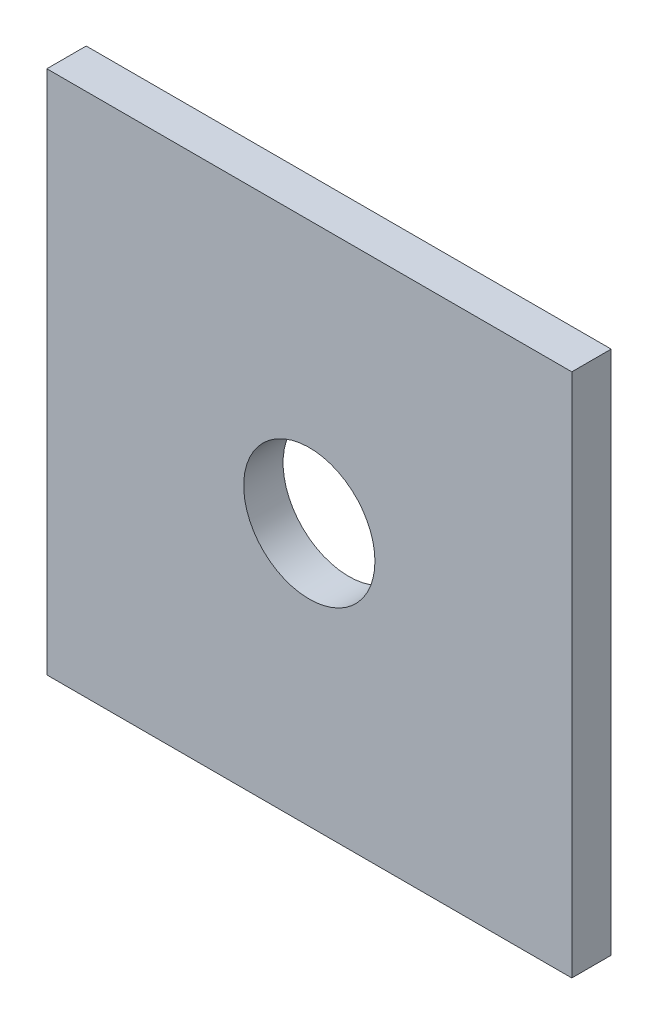
ISO-10303-21;
HEADER;
FILE_DESCRIPTION(('STEP AP214'),'2;1');
FILE_NAME('part.step','',(''),(''),'','','');
FILE_SCHEMA(('AUTOMOTIVE_DESIGN { 1 0 10303 214 1 1 1 1 }'));
ENDSEC;
DATA;
#1=APPLICATION_CONTEXT('core data for automotive mechanical design processes');
#2=APPLICATION_PROTOCOL_DEFINITION('international standard','automotive_design',2000,#1);
#3=PRODUCT_CONTEXT('',#1,'mechanical');
#4=PRODUCT('Part','Part','',(#3));
#5=PRODUCT_RELATED_PRODUCT_CATEGORY('part','',(#4));
#6=PRODUCT_DEFINITION_FORMATION('','',#4);
#7=PRODUCT_DEFINITION_CONTEXT('part definition',#1,'design');
#8=PRODUCT_DEFINITION('design','',#6,#7);
#9=PRODUCT_DEFINITION_SHAPE('','',#8);
#10=(LENGTH_UNIT() NAMED_UNIT(*) SI_UNIT(.MILLI.,.METRE.));
#11=(NAMED_UNIT(*) PLANE_ANGLE_UNIT() SI_UNIT($,.RADIAN.));
#12=(NAMED_UNIT(*) SI_UNIT($,.STERADIAN.) SOLID_ANGLE_UNIT());
#13=UNCERTAINTY_MEASURE_WITH_UNIT(LENGTH_MEASURE(1.E-05),#10,'distance_accuracy_value','');
#14=(GEOMETRIC_REPRESENTATION_CONTEXT(3) GLOBAL_UNCERTAINTY_ASSIGNED_CONTEXT((#13)) GLOBAL_UNIT_ASSIGNED_CONTEXT((#10,
#11,#12)) REPRESENTATION_CONTEXT('',''));
#15=CARTESIAN_POINT('',(0.,0.,0.));
#16=DIRECTION('',(0.,0.,1.));
#17=DIRECTION('',(1.,0.,0.));
#18=AXIS2_PLACEMENT_3D('',#15,#16,#17);
#19=CARTESIAN_POINT('',(0.,0.,3.));
#20=DIRECTION('',(0.,0.,1.));
#21=DIRECTION('',(1.,0.,0.));
#22=AXIS2_PLACEMENT_3D('',#19,#20,#21);
#23=PLANE('',#22);
#24=DIRECTION('',(0.,-1.,0.));
#25=VECTOR('',#24,1.);
#26=CARTESIAN_POINT('',(-20.,-20.,3.));
#27=LINE('',#26,#25);
#28=CARTESIAN_POINT('',(-20.,20.,3.));
#29=VERTEX_POINT('',#28);
#30=CARTESIAN_POINT('',(-20.,-20.,3.));
#31=VERTEX_POINT('',#30);
#32=EDGE_CURVE('E94',#29,#31,#27,.T.);
#33=ORIENTED_EDGE('',*,*,#32,.T.);
#34=DIRECTION('',(1.,0.,0.));
#35=VECTOR('',#34,1.);
#36=CARTESIAN_POINT('',(20.,-20.,3.));
#37=LINE('',#36,#35);
#38=CARTESIAN_POINT('',(20.,-20.,3.));
#39=VERTEX_POINT('',#38);
#40=EDGE_CURVE('E89',#31,#39,#37,.T.);
#41=ORIENTED_EDGE('',*,*,#40,.T.);
#42=DIRECTION('',(0.,1.,0.));
#43=VECTOR('',#42,1.);
#44=CARTESIAN_POINT('',(20.,-20.,3.));
#45=LINE('',#44,#43);
#46=CARTESIAN_POINT('',(20.,20.,3.));
#47=VERTEX_POINT('',#46);
#48=EDGE_CURVE('E92',#39,#47,#45,.T.);
#49=ORIENTED_EDGE('',*,*,#48,.T.);
#50=DIRECTION('',(-1.,0.,0.));
#51=VECTOR('',#50,1.);
#52=CARTESIAN_POINT('',(20.,20.,3.));
#53=LINE('',#52,#51);
#54=EDGE_CURVE('E59',#47,#29,#53,.T.);
#55=ORIENTED_EDGE('',*,*,#54,.T.);
#56=EDGE_LOOP('',(#33,#41,#49,#55));
#57=FACE_BOUND('',#56,.T.);
#58=CARTESIAN_POINT('',(0.,0.,3.));
#59=DIRECTION('',(0.,0.,1.));
#60=DIRECTION('',(1.,0.,0.));
#61=AXIS2_PLACEMENT_3D('',#58,#59,#60);
#62=CIRCLE('',#61,5.);
#63=CARTESIAN_POINT('',(5.,0.,3.));
#64=VERTEX_POINT('',#63);
#65=EDGE_CURVE('E114',#64,#64,#62,.T.);
#66=ORIENTED_EDGE('',*,*,#65,.F.);
#67=EDGE_LOOP('',(#66));
#68=FACE_BOUND('',#67,.T.);
#69=ADVANCED_FACE('F41',(#57,#68),#23,.T.);
#70=CARTESIAN_POINT('',(0.,0.,0.));
#71=DIRECTION('',(0.,0.,1.));
#72=DIRECTION('',(1.,0.,0.));
#73=AXIS2_PLACEMENT_3D('',#70,#71,#72);
#74=PLANE('',#73);
#75=DIRECTION('',(0.,-1.,0.));
#76=VECTOR('',#75,1.);
#77=CARTESIAN_POINT('',(-20.,-20.,0.));
#78=LINE('',#77,#76);
#79=CARTESIAN_POINT('',(-20.,20.,0.));
#80=VERTEX_POINT('',#79);
#81=CARTESIAN_POINT('',(-20.,-20.,0.));
#82=VERTEX_POINT('',#81);
#83=EDGE_CURVE('E110',#80,#82,#78,.T.);
#84=ORIENTED_EDGE('',*,*,#83,.F.);
#85=DIRECTION('',(-1.,0.,0.));
#86=VECTOR('',#85,1.);
#87=CARTESIAN_POINT('',(20.,20.,0.));
#88=LINE('',#87,#86);
#89=CARTESIAN_POINT('',(20.,20.,0.));
#90=VERTEX_POINT('',#89);
#91=EDGE_CURVE('E82',#90,#80,#88,.T.);
#92=ORIENTED_EDGE('',*,*,#91,.F.);
#93=DIRECTION('',(0.,1.,0.));
#94=VECTOR('',#93,1.);
#95=CARTESIAN_POINT('',(20.,-20.,0.));
#96=LINE('',#95,#94);
#97=CARTESIAN_POINT('',(20.,-20.,0.));
#98=VERTEX_POINT('',#97);
#99=EDGE_CURVE('E76',#98,#90,#96,.T.);
#100=ORIENTED_EDGE('',*,*,#99,.F.);
#101=DIRECTION('',(1.,0.,0.));
#102=VECTOR('',#101,1.);
#103=CARTESIAN_POINT('',(20.,-20.,0.));
#104=LINE('',#103,#102);
#105=EDGE_CURVE('E99',#82,#98,#104,.T.);
#106=ORIENTED_EDGE('',*,*,#105,.F.);
#107=EDGE_LOOP('',(#84,#92,#100,#106));
#108=FACE_BOUND('',#107,.T.);
#109=CARTESIAN_POINT('',(0.,0.,0.));
#110=DIRECTION('',(0.,0.,1.));
#111=DIRECTION('',(1.,0.,0.));
#112=AXIS2_PLACEMENT_3D('',#109,#110,#111);
#113=CIRCLE('',#112,5.);
#114=CARTESIAN_POINT('',(5.,0.,0.));
#115=VERTEX_POINT('',#114);
#116=EDGE_CURVE('E132',#115,#115,#113,.T.);
#117=ORIENTED_EDGE('',*,*,#116,.T.);
#118=EDGE_LOOP('',(#117));
#119=FACE_BOUND('',#118,.T.);
#120=ADVANCED_FACE('F127',(#108,#119),#74,.F.);
#121=CARTESIAN_POINT('',(-20.,-20.,3.));
#122=DIRECTION('',(1.,0.,0.));
#123=DIRECTION('',(0.,0.,-1.));
#124=AXIS2_PLACEMENT_3D('',#121,#122,#123);
#125=PLANE('',#124);
#126=ORIENTED_EDGE('',*,*,#83,.T.);
#127=DIRECTION('',(0.,0.,-1.));
#128=VECTOR('',#127,1.);
#129=CARTESIAN_POINT('',(-20.,-20.,3.));
#130=LINE('',#129,#128);
#131=EDGE_CURVE('E11',#31,#82,#130,.T.);
#132=ORIENTED_EDGE('',*,*,#131,.F.);
#133=ORIENTED_EDGE('',*,*,#32,.F.);
#134=DIRECTION('',(0.,0.,-1.));
#135=VECTOR('',#134,1.);
#136=CARTESIAN_POINT('',(-20.,20.,3.));
#137=LINE('',#136,#135);
#138=EDGE_CURVE('E106',#29,#80,#137,.T.);
#139=ORIENTED_EDGE('',*,*,#138,.T.);
#140=EDGE_LOOP('',(#126,#132,#133,#139));
#141=FACE_BOUND('',#140,.T.);
#142=ADVANCED_FACE('F43',(#141),#125,.F.);
#143=CARTESIAN_POINT('',(20.,-20.,3.));
#144=DIRECTION('',(0.,1.,0.));
#145=DIRECTION('',(-1.,0.,0.));
#146=AXIS2_PLACEMENT_3D('',#143,#144,#145);
#147=PLANE('',#146);
#148=ORIENTED_EDGE('',*,*,#105,.T.);
#149=DIRECTION('',(0.,0.,-1.));
#150=VECTOR('',#149,1.);
#151=CARTESIAN_POINT('',(20.,-20.,3.));
#152=LINE('',#151,#150);
#153=EDGE_CURVE('E51',#39,#98,#152,.T.);
#154=ORIENTED_EDGE('',*,*,#153,.F.);
#155=ORIENTED_EDGE('',*,*,#40,.F.);
#156=ORIENTED_EDGE('',*,*,#131,.T.);
#157=EDGE_LOOP('',(#148,#154,#155,#156));
#158=FACE_BOUND('',#157,.T.);
#159=ADVANCED_FACE('F98',(#158),#147,.F.);
#160=CARTESIAN_POINT('',(20.,-20.,3.));
#161=DIRECTION('',(-1.,0.,0.));
#162=DIRECTION('',(0.,0.,1.));
#163=AXIS2_PLACEMENT_3D('',#160,#161,#162);
#164=PLANE('',#163);
#165=ORIENTED_EDGE('',*,*,#99,.T.);
#166=DIRECTION('',(0.,0.,-1.));
#167=VECTOR('',#166,1.);
#168=CARTESIAN_POINT('',(20.,20.,3.));
#169=LINE('',#168,#167);
#170=EDGE_CURVE('E101',#47,#90,#169,.T.);
#171=ORIENTED_EDGE('',*,*,#170,.F.);
#172=ORIENTED_EDGE('',*,*,#48,.F.);
#173=ORIENTED_EDGE('',*,*,#153,.T.);
#174=EDGE_LOOP('',(#165,#171,#172,#173));
#175=FACE_BOUND('',#174,.T.);
#176=ADVANCED_FACE('F102',(#175),#164,.F.);
#177=CARTESIAN_POINT('',(20.,20.,3.));
#178=DIRECTION('',(0.,-1.,0.));
#179=DIRECTION('',(1.,0.,0.));
#180=AXIS2_PLACEMENT_3D('',#177,#178,#179);
#181=PLANE('',#180);
#182=ORIENTED_EDGE('',*,*,#91,.T.);
#183=ORIENTED_EDGE('',*,*,#138,.F.);
#184=ORIENTED_EDGE('',*,*,#54,.F.);
#185=ORIENTED_EDGE('',*,*,#170,.T.);
#186=EDGE_LOOP('',(#182,#183,#184,#185));
#187=FACE_BOUND('',#186,.T.);
#188=ADVANCED_FACE('F124',(#187),#181,.F.);
#189=CARTESIAN_POINT('',(0.,0.,3.));
#190=DIRECTION('',(0.,0.,-1.));
#191=DIRECTION('',(-1.,0.,0.));
#192=AXIS2_PLACEMENT_3D('',#189,#190,#191);
#193=CYLINDRICAL_SURFACE('',#192,5.);
#194=ORIENTED_EDGE('',*,*,#65,.T.);
#195=EDGE_LOOP('',(#194));
#196=FACE_BOUND('',#195,.T.);
#197=ORIENTED_EDGE('',*,*,#116,.F.);
#198=EDGE_LOOP('',(#197));
#199=FACE_BOUND('',#198,.T.);
#200=ADVANCED_FACE('F140',(#196,#199),#193,.F.);
#201=CLOSED_SHELL('',(#69,#120,#142,#159,#176,#188,#200));
#202=MANIFOLD_SOLID_BREP('B2',#201);
#203=ADVANCED_BREP_SHAPE_REPRESENTATION('',(#18,#202),#14);
#204=SHAPE_DEFINITION_REPRESENTATION(#9,#203);
ENDSEC;
END-ISO-10303-21;
